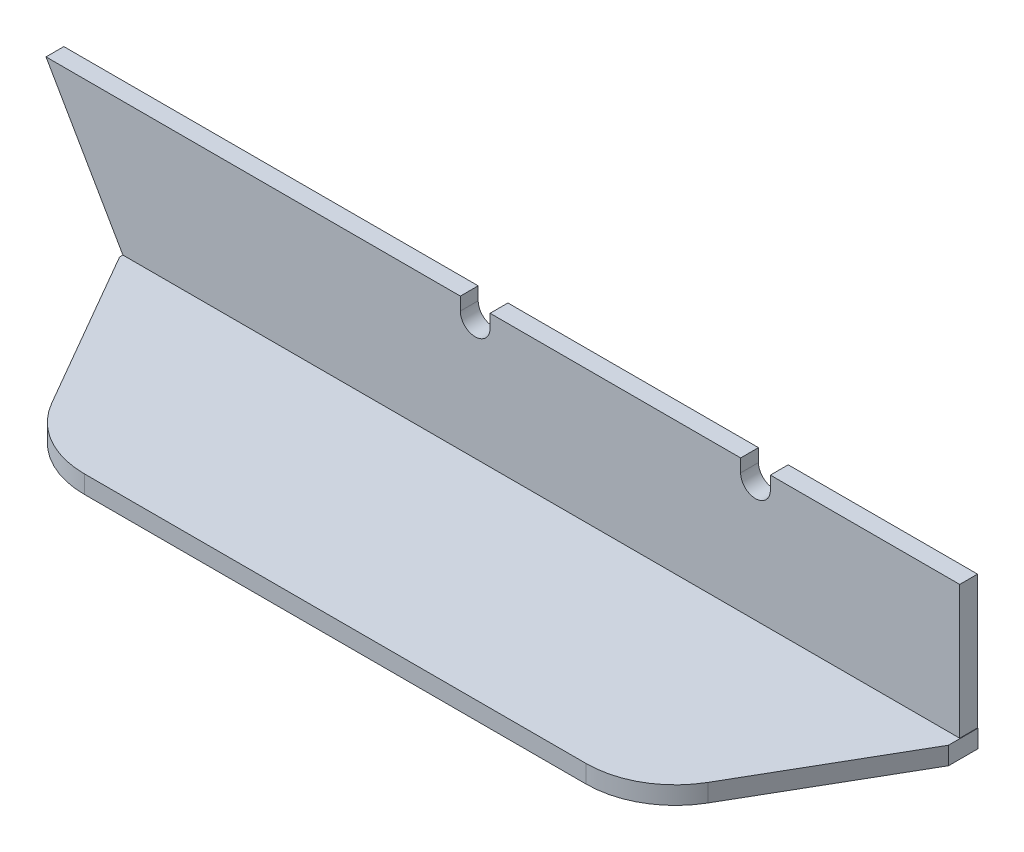
ISO-10303-21;
HEADER;
FILE_DESCRIPTION(('STEP AP214'),'2;1');
FILE_NAME('part.step','',(''),(''),'','','');
FILE_SCHEMA(('AUTOMOTIVE_DESIGN { 1 0 10303 214 1 1 1 1 }'));
ENDSEC;
DATA;
#1=APPLICATION_CONTEXT('core data for automotive mechanical design processes');
#2=APPLICATION_PROTOCOL_DEFINITION('international standard','automotive_design',2000,#1);
#3=PRODUCT_CONTEXT('',#1,'mechanical');
#4=PRODUCT('Part','Part','',(#3));
#5=PRODUCT_RELATED_PRODUCT_CATEGORY('part','',(#4));
#6=PRODUCT_DEFINITION_FORMATION('','',#4);
#7=PRODUCT_DEFINITION_CONTEXT('part definition',#1,'design');
#8=PRODUCT_DEFINITION('design','',#6,#7);
#9=PRODUCT_DEFINITION_SHAPE('','',#8);
#10=(LENGTH_UNIT() NAMED_UNIT(*) SI_UNIT(.MILLI.,.METRE.));
#11=(NAMED_UNIT(*) PLANE_ANGLE_UNIT() SI_UNIT($,.RADIAN.));
#12=(NAMED_UNIT(*) SI_UNIT($,.STERADIAN.) SOLID_ANGLE_UNIT());
#13=UNCERTAINTY_MEASURE_WITH_UNIT(LENGTH_MEASURE(1.E-05),#10,'distance_accuracy_value','');
#14=(GEOMETRIC_REPRESENTATION_CONTEXT(3) GLOBAL_UNCERTAINTY_ASSIGNED_CONTEXT((#13)) GLOBAL_UNIT_ASSIGNED_CONTEXT((#10,
#11,#12)) REPRESENTATION_CONTEXT('',''));
#15=CARTESIAN_POINT('',(0.,0.,0.));
#16=DIRECTION('',(0.,0.,1.));
#17=DIRECTION('',(1.,0.,0.));
#18=AXIS2_PLACEMENT_3D('',#15,#16,#17);
#19=CARTESIAN_POINT('',(-0.403411844343601,23.5,88.1));
#20=DIRECTION('',(0.,0.,1.));
#21=DIRECTION('',(1.,0.,0.));
#22=AXIS2_PLACEMENT_3D('',#19,#20,#21);
#23=PLANE('',#22);
#24=DIRECTION('',(0.,1.,0.));
#25=VECTOR('',#24,1.);
#26=CARTESIAN_POINT('',(42.2043046777613,25.,88.1));
#27=LINE('',#26,#25);
#28=CARTESIAN_POINT('',(42.2043046777612,22.,88.1));
#29=VERTEX_POINT('',#28);
#30=CARTESIAN_POINT('',(42.2043046777612,25.,88.1));
#31=VERTEX_POINT('',#30);
#32=EDGE_CURVE('E279',#29,#31,#27,.T.);
#33=ORIENTED_EDGE('',*,*,#32,.T.);
#34=DIRECTION('',(-1.,0.,0.));
#35=VECTOR('',#34,1.);
#36=CARTESIAN_POINT('',(70.,25.,88.1));
#37=LINE('',#36,#35);
#38=CARTESIAN_POINT('',(-42.2043046777622,25.,88.1));
#39=VERTEX_POINT('',#38);
#40=EDGE_CURVE('E200',#31,#39,#37,.T.);
#41=ORIENTED_EDGE('',*,*,#40,.T.);
#42=DIRECTION('',(0.,1.,0.));
#43=VECTOR('',#42,1.);
#44=CARTESIAN_POINT('',(-42.204304677762,25.,88.1));
#45=LINE('',#44,#43);
#46=CARTESIAN_POINT('',(-42.2043046777622,22.,88.1));
#47=VERTEX_POINT('',#46);
#48=EDGE_CURVE('E286',#47,#39,#45,.T.);
#49=ORIENTED_EDGE('',*,*,#48,.F.);
#50=DIRECTION('',(1.,0.,0.));
#51=VECTOR('',#50,1.);
#52=CARTESIAN_POINT('',(70.,22.,88.1));
#53=LINE('',#52,#51);
#54=EDGE_CURVE('E58',#47,#29,#53,.T.);
#55=ORIENTED_EDGE('',*,*,#54,.T.);
#56=EDGE_LOOP('',(#33,#41,#49,#55));
#57=FACE_BOUND('',#56,.T.);
#58=ADVANCED_FACE('F47',(#57),#23,.T.);
#59=CARTESIAN_POINT('',(-70.8068236886871,25.,50.));
#60=DIRECTION('',(-0.866025403784443,-0.499999999999992,0.));
#61=DIRECTION('',(-0.499999999999992,0.866025403784443,0.));
#62=AXIS2_PLACEMENT_3D('',#59,#60,#61);
#63=PLANE('',#62);
#64=DIRECTION('',(-0.377964473009223,0.654653670707983,-0.654653670707974));
#65=VECTOR('',#64,1.);
#66=CARTESIAN_POINT('',(-71.2471337493394,25.7626393961335,52.7963444524896));
#67=LINE('',#66,#65);
#68=CARTESIAN_POINT('',(-69.0747728811182,22.,56.5589838486231));
#69=VERTEX_POINT('',#68);
#70=CARTESIAN_POINT('',(-70.8068236886871,25.,53.5589838486231));
#71=VERTEX_POINT('',#70);
#72=EDGE_CURVE('E289',#69,#71,#67,.T.);
#73=ORIENTED_EDGE('',*,*,#72,.T.);
#74=DIRECTION('',(0.,0.,1.));
#75=VECTOR('',#74,1.);
#76=CARTESIAN_POINT('',(-70.8068236886871,25.,50.));
#77=LINE('',#76,#75);
#78=CARTESIAN_POINT('',(-70.8068236886871,25.,53.));
#79=VERTEX_POINT('',#78);
#80=EDGE_CURVE('E334',#79,#71,#77,.T.);
#81=ORIENTED_EDGE('',*,*,#80,.F.);
#82=DIRECTION('',(0.499999999999993,-0.866025403784443,0.));
#83=VECTOR('',#82,1.);
#84=CARTESIAN_POINT('',(-83.7394697185345,47.4,53.));
#85=LINE('',#84,#83);
#86=CARTESIAN_POINT('',(-83.7394697185345,47.4,53.));
#87=VERTEX_POINT('',#86);
#88=EDGE_CURVE('E258',#87,#79,#85,.T.);
#89=ORIENTED_EDGE('',*,*,#88,.F.);
#90=DIRECTION('',(0.,0.,-1.));
#91=VECTOR('',#90,1.);
#92=CARTESIAN_POINT('',(-83.7394697185345,47.4,53.));
#93=LINE('',#92,#91);
#94=CARTESIAN_POINT('',(-83.7394697185345,47.4,50.));
#95=VERTEX_POINT('',#94);
#96=EDGE_CURVE('E71',#87,#95,#93,.T.);
#97=ORIENTED_EDGE('',*,*,#96,.T.);
#98=DIRECTION('',(-0.499999999999993,0.866025403784443,0.));
#99=VECTOR('',#98,1.);
#100=CARTESIAN_POINT('',(-83.7394697185345,47.4,50.));
#101=LINE('',#100,#99);
#102=CARTESIAN_POINT('',(-69.0747728811182,22.,50.));
#103=VERTEX_POINT('',#102);
#104=EDGE_CURVE('E232',#103,#95,#101,.T.);
#105=ORIENTED_EDGE('',*,*,#104,.F.);
#106=DIRECTION('',(0.,0.,1.));
#107=VECTOR('',#106,1.);
#108=CARTESIAN_POINT('',(-69.0747728811182,22.,50.));
#109=LINE('',#108,#107);
#110=EDGE_CURVE('E11',#103,#69,#109,.T.);
#111=ORIENTED_EDGE('',*,*,#110,.T.);
#112=EDGE_LOOP('',(#73,#81,#89,#97,#105,#111));
#113=FACE_BOUND('',#112,.T.);
#114=ADVANCED_FACE('F233',(#113),#63,.T.);
#115=CARTESIAN_POINT('',(-69.0747728811182,22.,50.));
#116=DIRECTION('',(0.,-1.,0.));
#117=DIRECTION('',(-1.,0.,0.));
#118=AXIS2_PLACEMENT_3D('',#115,#116,#117);
#119=PLANE('',#118);
#120=CARTESIAN_POINT('',(42.2043046777613,22.,73.1));
#121=DIRECTION('',(0.,-1.,0.));
#122=DIRECTION('',(0.,0.,1.));
#123=AXIS2_PLACEMENT_3D('',#120,#121,#122);
#124=CIRCLE('',#123,15.);
#125=CARTESIAN_POINT('',(55.1946857345279,22.,80.6));
#126=VERTEX_POINT('',#125);
#127=EDGE_CURVE('E275',#126,#29,#124,.T.);
#128=ORIENTED_EDGE('',*,*,#127,.T.);
#129=ORIENTED_EDGE('',*,*,#54,.F.);
#130=CARTESIAN_POINT('',(-42.204304677762,22.,73.1));
#131=DIRECTION('',(0.,-1.,0.));
#132=DIRECTION('',(-0.86602540378444,0.,0.5));
#133=AXIS2_PLACEMENT_3D('',#130,#131,#132);
#134=CIRCLE('',#133,15.);
#135=CARTESIAN_POINT('',(-55.1946857345287,22.,80.6));
#136=VERTEX_POINT('',#135);
#137=EDGE_CURVE('E290',#47,#136,#134,.T.);
#138=ORIENTED_EDGE('',*,*,#137,.T.);
#139=DIRECTION('',(-0.5,0.,-0.86602540378444));
#140=VECTOR('',#139,1.);
#141=CARTESIAN_POINT('',(-71.3608599438825,22.,52.5993649053894));
#142=LINE('',#141,#140);
#143=EDGE_CURVE('E185',#136,#69,#142,.T.);
#144=ORIENTED_EDGE('',*,*,#143,.T.);
#145=ORIENTED_EDGE('',*,*,#110,.F.);
#146=DIRECTION('',(-1.,0.,0.));
#147=VECTOR('',#146,1.);
#148=CARTESIAN_POINT('',(70.,22.,50.));
#149=LINE('',#148,#147);
#150=CARTESIAN_POINT('',(70.,22.,50.));
#151=VERTEX_POINT('',#150);
#152=EDGE_CURVE('E227',#151,#103,#149,.T.);
#153=ORIENTED_EDGE('',*,*,#152,.F.);
#154=DIRECTION('',(0.,0.,1.));
#155=VECTOR('',#154,1.);
#156=CARTESIAN_POINT('',(70.,22.,50.));
#157=LINE('',#156,#155);
#158=CARTESIAN_POINT('',(70.,22.,54.9564434701786));
#159=VERTEX_POINT('',#158);
#160=EDGE_CURVE('E255',#151,#159,#157,.T.);
#161=ORIENTED_EDGE('',*,*,#160,.T.);
#162=DIRECTION('',(-0.5,0.,0.866025403784437));
#163=VECTOR('',#162,1.);
#164=CARTESIAN_POINT('',(46.286097746523,22.,96.030127018923));
#165=LINE('',#164,#163);
#166=EDGE_CURVE('E306',#159,#126,#165,.T.);
#167=ORIENTED_EDGE('',*,*,#166,.T.);
#168=EDGE_LOOP('',(#128,#129,#138,#144,#145,#153,#161,#167));
#169=FACE_BOUND('',#168,.T.);
#170=ADVANCED_FACE('F225',(#169),#119,.T.);
#171=CARTESIAN_POINT('',(-0.4414907963982,47.4,51.5));
#172=DIRECTION('',(0.,1.,0.));
#173=DIRECTION('',(1.,0.,0.));
#174=AXIS2_PLACEMENT_3D('',#171,#172,#173);
#175=PLANE('',#174);
#176=DIRECTION('',(0.,0.,-1.));
#177=VECTOR('',#176,1.);
#178=CARTESIAN_POINT('',(-14.0577217872793,47.4,52.25));
#179=LINE('',#178,#177);
#180=CARTESIAN_POINT('',(-14.0577217872794,47.4,53.));
#181=VERTEX_POINT('',#180);
#182=CARTESIAN_POINT('',(-14.0577217872794,47.4,50.));
#183=VERTEX_POINT('',#182);
#184=EDGE_CURVE('E270',#181,#183,#179,.T.);
#185=ORIENTED_EDGE('',*,*,#184,.T.);
#186=DIRECTION('',(-1.,0.,0.));
#187=VECTOR('',#186,1.);
#188=CARTESIAN_POINT('',(-70.8068236886871,47.4,50.));
#189=LINE('',#188,#187);
#190=EDGE_CURVE('E236',#183,#95,#189,.T.);
#191=ORIENTED_EDGE('',*,*,#190,.T.);
#192=ORIENTED_EDGE('',*,*,#96,.F.);
#193=DIRECTION('',(-1.,0.,0.));
#194=VECTOR('',#193,1.);
#195=CARTESIAN_POINT('',(-70.8068236886871,47.4,53.));
#196=LINE('',#195,#194);
#197=EDGE_CURVE('E298',#181,#87,#196,.T.);
#198=ORIENTED_EDGE('',*,*,#197,.F.);
#199=EDGE_LOOP('',(#185,#191,#192,#198));
#200=FACE_BOUND('',#199,.T.);
#201=ADVANCED_FACE('F495',(#200),#175,.T.);
#202=CARTESIAN_POINT('',(-70.8068236886871,25.,53.));
#203=DIRECTION('',(0.,0.,1.));
#204=DIRECTION('',(1.,0.,0.));
#205=AXIS2_PLACEMENT_3D('',#202,#203,#204);
#206=PLANE('',#205);
#207=DIRECTION('',(0.,1.,0.));
#208=VECTOR('',#207,1.);
#209=CARTESIAN_POINT('',(-14.0577217872793,35.11,53.));
#210=LINE('',#209,#208);
#211=CARTESIAN_POINT('',(-14.0577217872794,45.22,53.));
#212=VERTEX_POINT('',#211);
#213=EDGE_CURVE('E269',#212,#181,#210,.T.);
#214=ORIENTED_EDGE('',*,*,#213,.T.);
#215=ORIENTED_EDGE('',*,*,#197,.T.);
#216=ORIENTED_EDGE('',*,*,#88,.T.);
#217=DIRECTION('',(-1.,0.,0.));
#218=VECTOR('',#217,1.);
#219=CARTESIAN_POINT('',(-0.403411844343601,25.,53.));
#220=LINE('',#219,#218);
#221=CARTESIAN_POINT('',(69.9238420958906,25.,53.));
#222=VERTEX_POINT('',#221);
#223=EDGE_CURVE('E319',#222,#79,#220,.T.);
#224=ORIENTED_EDGE('',*,*,#223,.F.);
#225=DIRECTION('',(0.,1.,0.));
#226=VECTOR('',#225,1.);
#227=CARTESIAN_POINT('',(69.9238420958906,25.,53.));
#228=LINE('',#227,#226);
#229=CARTESIAN_POINT('',(69.9238420958906,47.4,53.));
#230=VERTEX_POINT('',#229);
#231=EDGE_CURVE('E302',#222,#230,#228,.T.);
#232=ORIENTED_EDGE('',*,*,#231,.T.);
#233=DIRECTION('',(-1.,0.,0.));
#234=VECTOR('',#233,1.);
#235=CARTESIAN_POINT('',(-70.8068236886871,47.4,53.));
#236=LINE('',#235,#234);
#237=CARTESIAN_POINT('',(38.0822782127207,47.4,53.));
#238=VERTEX_POINT('',#237);
#239=EDGE_CURVE('E390',#230,#238,#236,.T.);
#240=ORIENTED_EDGE('',*,*,#239,.T.);
#241=DIRECTION('',(0.,-1.,0.));
#242=VECTOR('',#241,1.);
#243=CARTESIAN_POINT('',(38.0822782127207,36.2,53.));
#244=LINE('',#243,#242);
#245=CARTESIAN_POINT('',(38.0822782127207,45.22,53.));
#246=VERTEX_POINT('',#245);
#247=EDGE_CURVE('E51',#238,#246,#244,.T.);
#248=ORIENTED_EDGE('',*,*,#247,.T.);
#249=CARTESIAN_POINT('',(35.5822782127207,45.22,53.));
#250=DIRECTION('',(0.,0.,-1.));
#251=DIRECTION('',(1.,0.,0.));
#252=AXIS2_PLACEMENT_3D('',#249,#250,#251);
#253=CIRCLE('',#252,2.5);
#254=CARTESIAN_POINT('',(33.0822782127208,45.22,53.));
#255=VERTEX_POINT('',#254);
#256=EDGE_CURVE('E327',#246,#255,#253,.T.);
#257=ORIENTED_EDGE('',*,*,#256,.T.);
#258=DIRECTION('',(0.,1.,0.));
#259=VECTOR('',#258,1.);
#260=CARTESIAN_POINT('',(33.0822782127208,35.11,53.));
#261=LINE('',#260,#259);
#262=CARTESIAN_POINT('',(33.0822782127208,47.4,53.));
#263=VERTEX_POINT('',#262);
#264=EDGE_CURVE('E344',#255,#263,#261,.T.);
#265=ORIENTED_EDGE('',*,*,#264,.T.);
#266=DIRECTION('',(-1.,0.,0.));
#267=VECTOR('',#266,1.);
#268=CARTESIAN_POINT('',(-70.8068236886871,47.4,53.));
#269=LINE('',#268,#267);
#270=CARTESIAN_POINT('',(-9.0577217872793,47.4,53.));
#271=VERTEX_POINT('',#270);
#272=EDGE_CURVE('E352',#263,#271,#269,.T.);
#273=ORIENTED_EDGE('',*,*,#272,.T.);
#274=DIRECTION('',(0.,-1.,0.));
#275=VECTOR('',#274,1.);
#276=CARTESIAN_POINT('',(-9.0577217872793,36.2,53.));
#277=LINE('',#276,#275);
#278=CARTESIAN_POINT('',(-9.0577217872793,45.22,53.));
#279=VERTEX_POINT('',#278);
#280=EDGE_CURVE('E365',#271,#279,#277,.T.);
#281=ORIENTED_EDGE('',*,*,#280,.T.);
#282=CARTESIAN_POINT('',(-11.5577217872793,45.22,53.));
#283=DIRECTION('',(0.,0.,-1.));
#284=DIRECTION('',(1.,0.,0.));
#285=AXIS2_PLACEMENT_3D('',#282,#283,#284);
#286=CIRCLE('',#285,2.5);
#287=EDGE_CURVE('E274',#279,#212,#286,.T.);
#288=ORIENTED_EDGE('',*,*,#287,.T.);
#289=EDGE_LOOP('',(#214,#215,#216,#224,#232,#240,#248,#257,#265,#273,#281,#288));
#290=FACE_BOUND('',#289,.T.);
#291=ADVANCED_FACE('F471',(#290),#206,.T.);
#292=CARTESIAN_POINT('',(69.9238420958906,25.,53.));
#293=DIRECTION('',(1.,0.,0.));
#294=DIRECTION('',(0.,1.,0.));
#295=AXIS2_PLACEMENT_3D('',#292,#293,#294);
#296=PLANE('',#295);
#297=DIRECTION('',(0.,0.,1.));
#298=VECTOR('',#297,1.);
#299=CARTESIAN_POINT('',(69.9238420958906,25.,51.5));
#300=LINE('',#299,#298);
#301=CARTESIAN_POINT('',(69.9238420958906,25.,50.));
#302=VERTEX_POINT('',#301);
#303=EDGE_CURVE('E315',#302,#222,#300,.T.);
#304=ORIENTED_EDGE('',*,*,#303,.F.);
#305=DIRECTION('',(0.,1.,0.));
#306=VECTOR('',#305,1.);
#307=CARTESIAN_POINT('',(69.9238420958906,25.,50.));
#308=LINE('',#307,#306);
#309=CARTESIAN_POINT('',(69.9238420958906,47.4,50.));
#310=VERTEX_POINT('',#309);
#311=EDGE_CURVE('E361',#302,#310,#308,.T.);
#312=ORIENTED_EDGE('',*,*,#311,.T.);
#313=DIRECTION('',(0.,0.,-1.));
#314=VECTOR('',#313,1.);
#315=CARTESIAN_POINT('',(69.9238420958906,47.4,50.));
#316=LINE('',#315,#314);
#317=EDGE_CURVE('E381',#230,#310,#316,.T.);
#318=ORIENTED_EDGE('',*,*,#317,.F.);
#319=ORIENTED_EDGE('',*,*,#231,.F.);
#320=EDGE_LOOP('',(#304,#312,#318,#319));
#321=FACE_BOUND('',#320,.T.);
#322=ADVANCED_FACE('F429',(#321),#296,.T.);
#323=CARTESIAN_POINT('',(70.,25.,50.));
#324=DIRECTION('',(0.,1.,0.));
#325=DIRECTION('',(1.,0.,0.));
#326=AXIS2_PLACEMENT_3D('',#323,#324,#325);
#327=PLANE('',#326);
#328=CARTESIAN_POINT('',(42.2043046777613,25.,73.1));
#329=DIRECTION('',(0.,1.,0.));
#330=DIRECTION('',(0.,0.,1.));
#331=AXIS2_PLACEMENT_3D('',#328,#329,#330);
#332=CIRCLE('',#331,15.);
#333=CARTESIAN_POINT('',(55.1946857345279,25.,80.6));
#334=VERTEX_POINT('',#333);
#335=EDGE_CURVE('E294',#31,#334,#332,.T.);
#336=ORIENTED_EDGE('',*,*,#335,.T.);
#337=DIRECTION('',(0.5,0.,-0.866025403784437));
#338=VECTOR('',#337,1.);
#339=CARTESIAN_POINT('',(63.670444356663,25.,65.9195554337725));
#340=LINE('',#339,#338);
#341=CARTESIAN_POINT('',(70.,25.,54.9564434701786));
#342=VERTEX_POINT('',#341);
#343=EDGE_CURVE('E259',#334,#342,#340,.T.);
#344=ORIENTED_EDGE('',*,*,#343,.T.);
#345=DIRECTION('',(0.,0.,1.));
#346=VECTOR('',#345,1.);
#347=CARTESIAN_POINT('',(70.,25.,50.));
#348=LINE('',#347,#346);
#349=CARTESIAN_POINT('',(70.,25.,50.));
#350=VERTEX_POINT('',#349);
#351=EDGE_CURVE('E320',#350,#342,#348,.T.);
#352=ORIENTED_EDGE('',*,*,#351,.F.);
#353=DIRECTION('',(-1.,0.,0.));
#354=VECTOR('',#353,1.);
#355=CARTESIAN_POINT('',(70.,25.,50.));
#356=LINE('',#355,#354);
#357=EDGE_CURVE('E248',#350,#302,#356,.T.);
#358=ORIENTED_EDGE('',*,*,#357,.T.);
#359=ORIENTED_EDGE('',*,*,#303,.T.);
#360=ORIENTED_EDGE('',*,*,#223,.T.);
#361=ORIENTED_EDGE('',*,*,#80,.T.);
#362=DIRECTION('',(0.5,0.,0.86602540378444));
#363=VECTOR('',#362,1.);
#364=CARTESIAN_POINT('',(-53.9765133337429,25.,82.7099364905391));
#365=LINE('',#364,#363);
#366=CARTESIAN_POINT('',(-55.1946857345287,25.,80.6));
#367=VERTEX_POINT('',#366);
#368=EDGE_CURVE('E252',#71,#367,#365,.T.);
#369=ORIENTED_EDGE('',*,*,#368,.T.);
#370=CARTESIAN_POINT('',(-42.204304677762,25.,73.1));
#371=DIRECTION('',(0.,1.,0.));
#372=DIRECTION('',(-0.86602540378444,0.,0.5));
#373=AXIS2_PLACEMENT_3D('',#370,#371,#372);
#374=CIRCLE('',#373,15.);
#375=EDGE_CURVE('E278',#367,#39,#374,.T.);
#376=ORIENTED_EDGE('',*,*,#375,.T.);
#377=ORIENTED_EDGE('',*,*,#40,.F.);
#378=EDGE_LOOP('',(#336,#344,#352,#358,#359,#360,#361,#369,#376,#377));
#379=FACE_BOUND('',#378,.T.);
#380=ADVANCED_FACE('F456',(#379),#327,.T.);
#381=CARTESIAN_POINT('',(70.,22.,50.));
#382=DIRECTION('',(1.,0.,0.));
#383=DIRECTION('',(0.,-1.,0.));
#384=AXIS2_PLACEMENT_3D('',#381,#382,#383);
#385=PLANE('',#384);
#386=DIRECTION('',(0.,-1.,0.));
#387=VECTOR('',#386,1.);
#388=CARTESIAN_POINT('',(70.,23.5,54.9564434701786));
#389=LINE('',#388,#387);
#390=EDGE_CURVE('E297',#342,#159,#389,.T.);
#391=ORIENTED_EDGE('',*,*,#390,.T.);
#392=ORIENTED_EDGE('',*,*,#160,.F.);
#393=DIRECTION('',(0.,-1.,0.));
#394=VECTOR('',#393,1.);
#395=CARTESIAN_POINT('',(70.,25.,50.));
#396=LINE('',#395,#394);
#397=EDGE_CURVE('E242',#350,#151,#396,.T.);
#398=ORIENTED_EDGE('',*,*,#397,.F.);
#399=ORIENTED_EDGE('',*,*,#351,.T.);
#400=EDGE_LOOP('',(#391,#392,#398,#399));
#401=FACE_BOUND('',#400,.T.);
#402=ADVANCED_FACE('F451',(#401),#385,.T.);
#403=CARTESIAN_POINT('',(-70.8068236886871,25.,53.5589838486231));
#404=DIRECTION('',(0.86602540378444,0.,-0.5));
#405=DIRECTION('',(0.,-1.,0.));
#406=AXIS2_PLACEMENT_3D('',#403,#404,#405);
#407=PLANE('',#406);
#408=ORIENTED_EDGE('',*,*,#72,.F.);
#409=ORIENTED_EDGE('',*,*,#143,.F.);
#410=DIRECTION('',(0.,-1.,0.));
#411=VECTOR('',#410,1.);
#412=CARTESIAN_POINT('',(-55.1946857345287,25.,80.6));
#413=LINE('',#412,#411);
#414=EDGE_CURVE('E314',#367,#136,#413,.T.);
#415=ORIENTED_EDGE('',*,*,#414,.F.);
#416=ORIENTED_EDGE('',*,*,#368,.F.);
#417=EDGE_LOOP('',(#408,#409,#415,#416));
#418=FACE_BOUND('',#417,.T.);
#419=ADVANCED_FACE('F468',(#418),#407,.F.);
#420=CARTESIAN_POINT('',(-42.204304677762,25.,73.1));
#421=DIRECTION('',(0.,-1.,0.));
#422=DIRECTION('',(-0.86602540378444,0.,0.5));
#423=AXIS2_PLACEMENT_3D('',#420,#421,#422);
#424=CYLINDRICAL_SURFACE('',#423,15.);
#425=ORIENTED_EDGE('',*,*,#375,.F.);
#426=ORIENTED_EDGE('',*,*,#414,.T.);
#427=ORIENTED_EDGE('',*,*,#137,.F.);
#428=ORIENTED_EDGE('',*,*,#48,.T.);
#429=EDGE_LOOP('',(#425,#426,#427,#428));
#430=FACE_BOUND('',#429,.T.);
#431=ADVANCED_FACE('F466',(#430),#424,.T.);
#432=CARTESIAN_POINT('',(42.2043046777613,25.,73.1));
#433=DIRECTION('',(0.,-1.,0.));
#434=DIRECTION('',(0.,0.,1.));
#435=AXIS2_PLACEMENT_3D('',#432,#433,#434);
#436=CYLINDRICAL_SURFACE('',#435,15.);
#437=ORIENTED_EDGE('',*,*,#335,.F.);
#438=ORIENTED_EDGE('',*,*,#32,.F.);
#439=ORIENTED_EDGE('',*,*,#127,.F.);
#440=DIRECTION('',(0.,-1.,0.));
#441=VECTOR('',#440,1.);
#442=CARTESIAN_POINT('',(55.1946857345279,25.,80.6));
#443=LINE('',#442,#441);
#444=EDGE_CURVE('E263',#334,#126,#443,.T.);
#445=ORIENTED_EDGE('',*,*,#444,.F.);
#446=EDGE_LOOP('',(#437,#438,#439,#445));
#447=FACE_BOUND('',#446,.T.);
#448=ADVANCED_FACE('F461',(#447),#436,.T.);
#449=CARTESIAN_POINT('',(55.1946857345279,25.,80.6));
#450=DIRECTION('',(-0.866025403784437,0.,-0.5));
#451=DIRECTION('',(-0.5,0.,0.866025403784437));
#452=AXIS2_PLACEMENT_3D('',#449,#450,#451);
#453=PLANE('',#452);
#454=ORIENTED_EDGE('',*,*,#343,.F.);
#455=ORIENTED_EDGE('',*,*,#444,.T.);
#456=ORIENTED_EDGE('',*,*,#166,.F.);
#457=ORIENTED_EDGE('',*,*,#390,.F.);
#458=EDGE_LOOP('',(#454,#455,#456,#457));
#459=FACE_BOUND('',#458,.T.);
#460=ADVANCED_FACE('F49',(#459),#453,.F.);
#461=CARTESIAN_POINT('',(-0.403411844343601,23.5,50.));
#462=DIRECTION('',(0.,0.,1.));
#463=DIRECTION('',(1.,0.,0.));
#464=AXIS2_PLACEMENT_3D('',#461,#462,#463);
#465=PLANE('',#464);
#466=DIRECTION('',(0.,-1.,0.));
#467=VECTOR('',#466,1.);
#468=CARTESIAN_POINT('',(-14.0577217872794,34.36,50.));
#469=LINE('',#468,#467);
#470=CARTESIAN_POINT('',(-14.0577217872794,45.22,50.));
#471=VERTEX_POINT('',#470);
#472=EDGE_CURVE('E268',#183,#471,#469,.T.);
#473=ORIENTED_EDGE('',*,*,#472,.T.);
#474=CARTESIAN_POINT('',(-11.5577217872793,45.22,50.));
#475=DIRECTION('',(0.,0.,1.));
#476=DIRECTION('',(1.,0.,0.));
#477=AXIS2_PLACEMENT_3D('',#474,#475,#476);
#478=CIRCLE('',#477,2.5);
#479=CARTESIAN_POINT('',(-9.0577217872793,45.22,50.));
#480=VERTEX_POINT('',#479);
#481=EDGE_CURVE('E293',#471,#480,#478,.T.);
#482=ORIENTED_EDGE('',*,*,#481,.T.);
#483=DIRECTION('',(0.,1.,0.));
#484=VECTOR('',#483,1.);
#485=CARTESIAN_POINT('',(-9.0577217872793,35.45,50.));
#486=LINE('',#485,#484);
#487=CARTESIAN_POINT('',(-9.0577217872793,47.4,50.));
#488=VERTEX_POINT('',#487);
#489=EDGE_CURVE('E280',#480,#488,#486,.T.);
#490=ORIENTED_EDGE('',*,*,#489,.T.);
#491=DIRECTION('',(-1.,0.,0.));
#492=VECTOR('',#491,1.);
#493=CARTESIAN_POINT('',(-70.8068236886871,47.4,50.));
#494=LINE('',#493,#492);
#495=CARTESIAN_POINT('',(33.0822782127208,47.4,50.));
#496=VERTEX_POINT('',#495);
#497=EDGE_CURVE('E356',#496,#488,#494,.T.);
#498=ORIENTED_EDGE('',*,*,#497,.F.);
#499=DIRECTION('',(0.,-1.,0.));
#500=VECTOR('',#499,1.);
#501=CARTESIAN_POINT('',(33.0822782127208,34.36,50.));
#502=LINE('',#501,#500);
#503=CARTESIAN_POINT('',(33.0822782127208,45.22,50.));
#504=VERTEX_POINT('',#503);
#505=EDGE_CURVE('E328',#496,#504,#502,.T.);
#506=ORIENTED_EDGE('',*,*,#505,.T.);
#507=CARTESIAN_POINT('',(35.5822782127207,45.22,50.));
#508=DIRECTION('',(0.,0.,1.));
#509=DIRECTION('',(1.,0.,0.));
#510=AXIS2_PLACEMENT_3D('',#507,#508,#509);
#511=CIRCLE('',#510,2.5);
#512=CARTESIAN_POINT('',(38.0822782127207,45.22,50.));
#513=VERTEX_POINT('',#512);
#514=EDGE_CURVE('E307',#504,#513,#511,.T.);
#515=ORIENTED_EDGE('',*,*,#514,.T.);
#516=DIRECTION('',(0.,1.,0.));
#517=VECTOR('',#516,1.);
#518=CARTESIAN_POINT('',(38.0822782127207,35.45,50.));
#519=LINE('',#518,#517);
#520=CARTESIAN_POINT('',(38.0822782127207,47.4,50.));
#521=VERTEX_POINT('',#520);
#522=EDGE_CURVE('E357',#513,#521,#519,.T.);
#523=ORIENTED_EDGE('',*,*,#522,.T.);
#524=DIRECTION('',(-1.,0.,0.));
#525=VECTOR('',#524,1.);
#526=CARTESIAN_POINT('',(-70.8068236886871,47.4,50.));
#527=LINE('',#526,#525);
#528=EDGE_CURVE('E377',#310,#521,#527,.T.);
#529=ORIENTED_EDGE('',*,*,#528,.F.);
#530=ORIENTED_EDGE('',*,*,#311,.F.);
#531=ORIENTED_EDGE('',*,*,#357,.F.);
#532=ORIENTED_EDGE('',*,*,#397,.T.);
#533=ORIENTED_EDGE('',*,*,#152,.T.);
#534=ORIENTED_EDGE('',*,*,#104,.T.);
#535=ORIENTED_EDGE('',*,*,#190,.F.);
#536=EDGE_LOOP('',(#473,#482,#490,#498,#506,#515,#523,#529,#530,#531,#532,#533,#534,#535));
#537=FACE_BOUND('',#536,.T.);
#538=ADVANCED_FACE('F239',(#537),#465,.F.);
#539=CARTESIAN_POINT('',(-0.4414907963982,47.4,51.5));
#540=DIRECTION('',(0.,1.,0.));
#541=DIRECTION('',(1.,0.,0.));
#542=AXIS2_PLACEMENT_3D('',#539,#540,#541);
#543=PLANE('',#542);
#544=DIRECTION('',(0.,0.,1.));
#545=VECTOR('',#544,1.);
#546=CARTESIAN_POINT('',(38.0822782127207,47.4,52.25));
#547=LINE('',#546,#545);
#548=EDGE_CURVE('E373',#521,#238,#547,.T.);
#549=ORIENTED_EDGE('',*,*,#548,.T.);
#550=ORIENTED_EDGE('',*,*,#239,.F.);
#551=ORIENTED_EDGE('',*,*,#317,.T.);
#552=ORIENTED_EDGE('',*,*,#528,.T.);
#553=EDGE_LOOP('',(#549,#550,#551,#552));
#554=FACE_BOUND('',#553,.T.);
#555=ADVANCED_FACE('F425',(#554),#543,.T.);
#556=CARTESIAN_POINT('',(-0.4414907963982,47.4,51.5));
#557=DIRECTION('',(0.,1.,0.));
#558=DIRECTION('',(1.,0.,0.));
#559=AXIS2_PLACEMENT_3D('',#556,#557,#558);
#560=PLANE('',#559);
#561=DIRECTION('',(0.,0.,1.));
#562=VECTOR('',#561,1.);
#563=CARTESIAN_POINT('',(-9.0577217872793,47.4,52.25));
#564=LINE('',#563,#562);
#565=EDGE_CURVE('E285',#488,#271,#564,.T.);
#566=ORIENTED_EDGE('',*,*,#565,.T.);
#567=ORIENTED_EDGE('',*,*,#272,.F.);
#568=DIRECTION('',(0.,0.,-1.));
#569=VECTOR('',#568,1.);
#570=CARTESIAN_POINT('',(33.0822782127208,47.4,52.25));
#571=LINE('',#570,#569);
#572=EDGE_CURVE('E323',#263,#496,#571,.T.);
#573=ORIENTED_EDGE('',*,*,#572,.T.);
#574=ORIENTED_EDGE('',*,*,#497,.T.);
#575=EDGE_LOOP('',(#566,#567,#573,#574));
#576=FACE_BOUND('',#575,.T.);
#577=ADVANCED_FACE('F509',(#576),#560,.T.);
#578=CARTESIAN_POINT('',(38.0822782127207,47.4,53.));
#579=DIRECTION('',(1.,0.,0.));
#580=DIRECTION('',(0.,-1.,0.));
#581=AXIS2_PLACEMENT_3D('',#578,#579,#580);
#582=PLANE('',#581);
#583=ORIENTED_EDGE('',*,*,#247,.F.);
#584=ORIENTED_EDGE('',*,*,#548,.F.);
#585=ORIENTED_EDGE('',*,*,#522,.F.);
#586=DIRECTION('',(0.,0.,-1.));
#587=VECTOR('',#586,1.);
#588=CARTESIAN_POINT('',(38.0822782127207,45.22,53.));
#589=LINE('',#588,#587);
#590=EDGE_CURVE('E311',#246,#513,#589,.T.);
#591=ORIENTED_EDGE('',*,*,#590,.F.);
#592=EDGE_LOOP('',(#583,#584,#585,#591));
#593=FACE_BOUND('',#592,.T.);
#594=ADVANCED_FACE('F422',(#593),#582,.F.);
#595=CARTESIAN_POINT('',(35.5822782127207,45.22,53.));
#596=DIRECTION('',(0.,0.,-1.));
#597=DIRECTION('',(1.,0.,0.));
#598=AXIS2_PLACEMENT_3D('',#595,#596,#597);
#599=CYLINDRICAL_SURFACE('',#598,2.5);
#600=ORIENTED_EDGE('',*,*,#256,.F.);
#601=ORIENTED_EDGE('',*,*,#590,.T.);
#602=ORIENTED_EDGE('',*,*,#514,.F.);
#603=DIRECTION('',(0.,0.,-1.));
#604=VECTOR('',#603,1.);
#605=CARTESIAN_POINT('',(33.0822782127208,45.22,53.));
#606=LINE('',#605,#604);
#607=EDGE_CURVE('E348',#255,#504,#606,.T.);
#608=ORIENTED_EDGE('',*,*,#607,.F.);
#609=EDGE_LOOP('',(#600,#601,#602,#608));
#610=FACE_BOUND('',#609,.T.);
#611=ADVANCED_FACE('F519',(#610),#599,.F.);
#612=CARTESIAN_POINT('',(33.0822782127208,45.22,53.));
#613=DIRECTION('',(-1.,0.,0.));
#614=DIRECTION('',(0.,0.,1.));
#615=AXIS2_PLACEMENT_3D('',#612,#613,#614);
#616=PLANE('',#615);
#617=ORIENTED_EDGE('',*,*,#264,.F.);
#618=ORIENTED_EDGE('',*,*,#607,.T.);
#619=ORIENTED_EDGE('',*,*,#505,.F.);
#620=ORIENTED_EDGE('',*,*,#572,.F.);
#621=EDGE_LOOP('',(#617,#618,#619,#620));
#622=FACE_BOUND('',#621,.T.);
#623=ADVANCED_FACE('F516',(#622),#616,.F.);
#624=CARTESIAN_POINT('',(-11.5577217872793,45.22,53.));
#625=DIRECTION('',(0.,0.,-1.));
#626=DIRECTION('',(1.,0.,0.));
#627=AXIS2_PLACEMENT_3D('',#624,#625,#626);
#628=CYLINDRICAL_SURFACE('',#627,2.5);
#629=ORIENTED_EDGE('',*,*,#287,.F.);
#630=DIRECTION('',(0.,0.,-1.));
#631=VECTOR('',#630,1.);
#632=CARTESIAN_POINT('',(-9.0577217872793,45.22,53.));
#633=LINE('',#632,#631);
#634=EDGE_CURVE('E284',#279,#480,#633,.T.);
#635=ORIENTED_EDGE('',*,*,#634,.T.);
#636=ORIENTED_EDGE('',*,*,#481,.F.);
#637=DIRECTION('',(0.,0.,-1.));
#638=VECTOR('',#637,1.);
#639=CARTESIAN_POINT('',(-14.0577217872794,45.22,53.));
#640=LINE('',#639,#638);
#641=EDGE_CURVE('E264',#212,#471,#640,.T.);
#642=ORIENTED_EDGE('',*,*,#641,.F.);
#643=EDGE_LOOP('',(#629,#635,#636,#642));
#644=FACE_BOUND('',#643,.T.);
#645=ADVANCED_FACE('F504',(#644),#628,.F.);
#646=CARTESIAN_POINT('',(-14.0577217872794,45.22,53.));
#647=DIRECTION('',(-1.,0.,0.));
#648=DIRECTION('',(0.,0.,1.));
#649=AXIS2_PLACEMENT_3D('',#646,#647,#648);
#650=PLANE('',#649);
#651=ORIENTED_EDGE('',*,*,#213,.F.);
#652=ORIENTED_EDGE('',*,*,#641,.T.);
#653=ORIENTED_EDGE('',*,*,#472,.F.);
#654=ORIENTED_EDGE('',*,*,#184,.F.);
#655=EDGE_LOOP('',(#651,#652,#653,#654));
#656=FACE_BOUND('',#655,.T.);
#657=ADVANCED_FACE('F498',(#656),#650,.F.);
#658=CARTESIAN_POINT('',(-9.0577217872793,47.4,53.));
#659=DIRECTION('',(1.,0.,0.));
#660=DIRECTION('',(0.,-1.,0.));
#661=AXIS2_PLACEMENT_3D('',#658,#659,#660);
#662=PLANE('',#661);
#663=ORIENTED_EDGE('',*,*,#280,.F.);
#664=ORIENTED_EDGE('',*,*,#565,.F.);
#665=ORIENTED_EDGE('',*,*,#489,.F.);
#666=ORIENTED_EDGE('',*,*,#634,.F.);
#667=EDGE_LOOP('',(#663,#664,#665,#666));
#668=FACE_BOUND('',#667,.T.);
#669=ADVANCED_FACE('F507',(#668),#662,.F.);
#670=CLOSED_SHELL('',(#58,#114,#170,#201,#291,#322,#380,#402,#419,#431,#448,#460,#538,#555,#577,
#594,#611,#623,#645,#657,#669));
#671=MANIFOLD_SOLID_BREP('B2',#670);
#672=ADVANCED_BREP_SHAPE_REPRESENTATION('',(#18,#671),#14);
#673=SHAPE_DEFINITION_REPRESENTATION(#9,#672);
ENDSEC;
END-ISO-10303-21;
